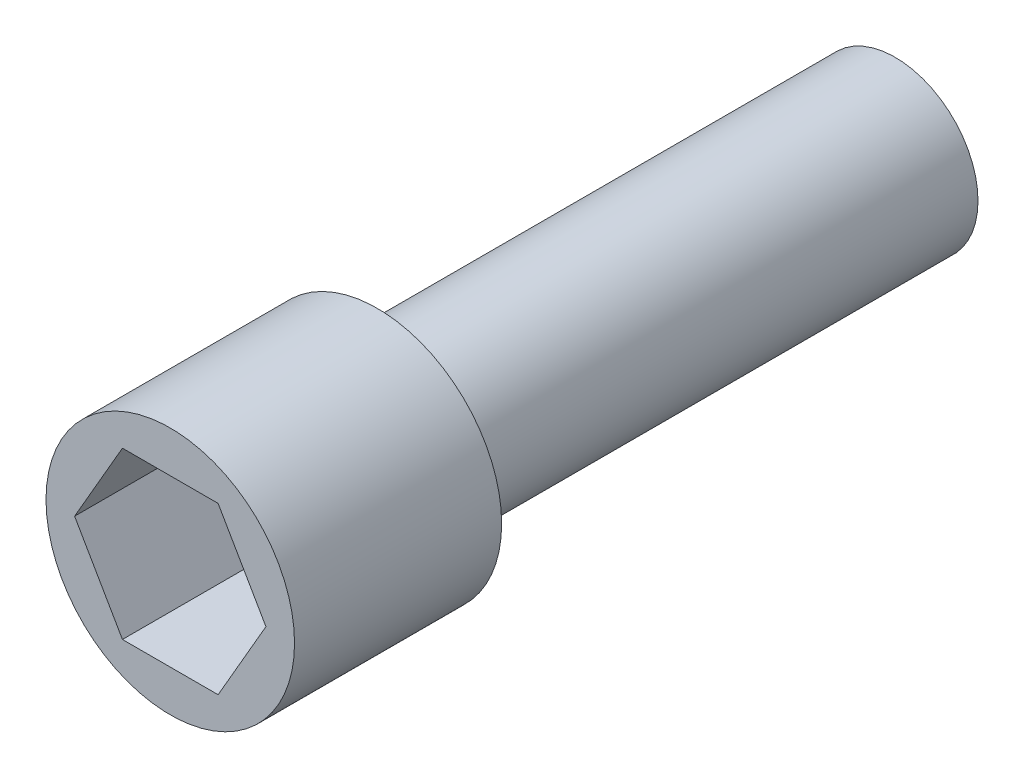
ISO-10303-21;
HEADER;
FILE_DESCRIPTION(('STEP AP214'),'2;1');
FILE_NAME('part.step','',(''),(''),'','','');
FILE_SCHEMA(('AUTOMOTIVE_DESIGN { 1 0 10303 214 1 1 1 1 }'));
ENDSEC;
DATA;
#1=APPLICATION_CONTEXT('core data for automotive mechanical design processes');
#2=APPLICATION_PROTOCOL_DEFINITION('international standard','automotive_design',2000,#1);
#3=PRODUCT_CONTEXT('',#1,'mechanical');
#4=PRODUCT('Part','Part','',(#3));
#5=PRODUCT_RELATED_PRODUCT_CATEGORY('part','',(#4));
#6=PRODUCT_DEFINITION_FORMATION('','',#4);
#7=PRODUCT_DEFINITION_CONTEXT('part definition',#1,'design');
#8=PRODUCT_DEFINITION('design','',#6,#7);
#9=PRODUCT_DEFINITION_SHAPE('','',#8);
#10=(LENGTH_UNIT() NAMED_UNIT(*) SI_UNIT(.MILLI.,.METRE.));
#11=(NAMED_UNIT(*) PLANE_ANGLE_UNIT() SI_UNIT($,.RADIAN.));
#12=(NAMED_UNIT(*) SI_UNIT($,.STERADIAN.) SOLID_ANGLE_UNIT());
#13=UNCERTAINTY_MEASURE_WITH_UNIT(LENGTH_MEASURE(1.E-05),#10,'distance_accuracy_value','');
#14=(GEOMETRIC_REPRESENTATION_CONTEXT(3) GLOBAL_UNCERTAINTY_ASSIGNED_CONTEXT((#13)) GLOBAL_UNIT_ASSIGNED_CONTEXT((#10,
#11,#12)) REPRESENTATION_CONTEXT('',''));
#15=CARTESIAN_POINT('',(0.,0.,0.));
#16=DIRECTION('',(0.,0.,1.));
#17=DIRECTION('',(1.,0.,0.));
#18=AXIS2_PLACEMENT_3D('',#15,#16,#17);
#19=CARTESIAN_POINT('',(0.,0.,-10.));
#20=DIRECTION('',(0.,0.,1.));
#21=DIRECTION('',(1.,0.,0.));
#22=AXIS2_PLACEMENT_3D('',#19,#20,#21);
#23=CYLINDRICAL_SURFACE('',#22,6.);
#24=CARTESIAN_POINT('',(0.,0.,-10.));
#25=DIRECTION('',(0.,0.,1.));
#26=DIRECTION('',(1.,0.,0.));
#27=AXIS2_PLACEMENT_3D('',#24,#25,#26);
#28=CIRCLE('',#27,6.);
#29=CARTESIAN_POINT('',(6.,0.,-10.));
#30=VERTEX_POINT('',#29);
#31=EDGE_CURVE('E11',#30,#30,#28,.T.);
#32=ORIENTED_EDGE('',*,*,#31,.T.);
#33=EDGE_LOOP('',(#32));
#34=FACE_BOUND('',#33,.T.);
#35=CARTESIAN_POINT('',(0.,0.,0.));
#36=DIRECTION('',(0.,0.,1.));
#37=DIRECTION('',(1.,0.,0.));
#38=AXIS2_PLACEMENT_3D('',#35,#36,#37);
#39=CIRCLE('',#38,6.);
#40=CARTESIAN_POINT('',(6.,0.,0.));
#41=VERTEX_POINT('',#40);
#42=EDGE_CURVE('E42',#41,#41,#39,.T.);
#43=ORIENTED_EDGE('',*,*,#42,.F.);
#44=EDGE_LOOP('',(#43));
#45=FACE_BOUND('',#44,.T.);
#46=ADVANCED_FACE('F39',(#34,#45),#23,.T.);
#47=CARTESIAN_POINT('',(0.,0.,-10.));
#48=DIRECTION('',(0.,0.,1.));
#49=DIRECTION('',(1.,0.,0.));
#50=AXIS2_PLACEMENT_3D('',#47,#48,#49);
#51=PLANE('',#50);
#52=CARTESIAN_POINT('',(0.,0.,-10.));
#53=DIRECTION('',(0.,0.,1.));
#54=DIRECTION('',(1.,0.,0.));
#55=AXIS2_PLACEMENT_3D('',#52,#53,#54);
#56=CIRCLE('',#55,4.);
#57=CARTESIAN_POINT('',(4.,0.,-10.));
#58=VERTEX_POINT('',#57);
#59=EDGE_CURVE('E148',#58,#58,#56,.T.);
#60=ORIENTED_EDGE('',*,*,#59,.T.);
#61=EDGE_LOOP('',(#60));
#62=FACE_BOUND('',#61,.T.);
#63=ORIENTED_EDGE('',*,*,#31,.F.);
#64=EDGE_LOOP('',(#63));
#65=FACE_BOUND('',#64,.T.);
#66=ADVANCED_FACE('F158',(#62,#65),#51,.F.);
#67=CARTESIAN_POINT('',(0.,0.,0.));
#68=DIRECTION('',(0.,0.,1.));
#69=DIRECTION('',(1.,0.,0.));
#70=AXIS2_PLACEMENT_3D('',#67,#68,#69);
#71=PLANE('',#70);
#72=DIRECTION('',(-0.5,0.866025403784438,0.));
#73=VECTOR('',#72,1.);
#74=CARTESIAN_POINT('',(4.61880215351701,0.,0.));
#75=LINE('',#74,#73);
#76=CARTESIAN_POINT('',(4.61880215351701,0.,0.));
#77=VERTEX_POINT('',#76);
#78=CARTESIAN_POINT('',(2.3094010767585,4.,0.));
#79=VERTEX_POINT('',#78);
#80=EDGE_CURVE('E53',#77,#79,#75,.T.);
#81=ORIENTED_EDGE('',*,*,#80,.F.);
#82=DIRECTION('',(0.5,0.866025403784439,0.));
#83=VECTOR('',#82,1.);
#84=CARTESIAN_POINT('',(2.3094010767585,-4.,0.));
#85=LINE('',#84,#83);
#86=CARTESIAN_POINT('',(2.3094010767585,-4.,0.));
#87=VERTEX_POINT('',#86);
#88=EDGE_CURVE('E136',#87,#77,#85,.T.);
#89=ORIENTED_EDGE('',*,*,#88,.F.);
#90=DIRECTION('',(1.,0.,0.));
#91=VECTOR('',#90,1.);
#92=CARTESIAN_POINT('',(-2.3094010767585,-4.,0.));
#93=LINE('',#92,#91);
#94=CARTESIAN_POINT('',(-2.3094010767585,-4.,0.));
#95=VERTEX_POINT('',#94);
#96=EDGE_CURVE('E134',#95,#87,#93,.T.);
#97=ORIENTED_EDGE('',*,*,#96,.F.);
#98=DIRECTION('',(0.5,-0.866025403784438,0.));
#99=VECTOR('',#98,1.);
#100=CARTESIAN_POINT('',(-4.61880215351701,0.,0.));
#101=LINE('',#100,#99);
#102=CARTESIAN_POINT('',(-4.61880215351701,0.,0.));
#103=VERTEX_POINT('',#102);
#104=EDGE_CURVE('E101',#103,#95,#101,.T.);
#105=ORIENTED_EDGE('',*,*,#104,.F.);
#106=DIRECTION('',(-0.5,-0.866025403784439,0.));
#107=VECTOR('',#106,1.);
#108=CARTESIAN_POINT('',(-2.3094010767585,4.,0.));
#109=LINE('',#108,#107);
#110=CARTESIAN_POINT('',(-2.3094010767585,4.,0.));
#111=VERTEX_POINT('',#110);
#112=EDGE_CURVE('E130',#111,#103,#109,.T.);
#113=ORIENTED_EDGE('',*,*,#112,.F.);
#114=DIRECTION('',(-1.,0.,0.));
#115=VECTOR('',#114,1.);
#116=CARTESIAN_POINT('',(2.3094010767585,4.,0.));
#117=LINE('',#116,#115);
#118=EDGE_CURVE('E127',#79,#111,#117,.T.);
#119=ORIENTED_EDGE('',*,*,#118,.F.);
#120=EDGE_LOOP('',(#81,#89,#97,#105,#113,#119));
#121=FACE_BOUND('',#120,.T.);
#122=ORIENTED_EDGE('',*,*,#42,.T.);
#123=EDGE_LOOP('',(#122));
#124=FACE_BOUND('',#123,.T.);
#125=ADVANCED_FACE('F155',(#121,#124),#71,.T.);
#126=CARTESIAN_POINT('',(0.,0.,-35.));
#127=DIRECTION('',(0.,0.,1.));
#128=DIRECTION('',(1.,0.,0.));
#129=AXIS2_PLACEMENT_3D('',#126,#127,#128);
#130=CYLINDRICAL_SURFACE('',#129,4.);
#131=CARTESIAN_POINT('',(0.,0.,-35.));
#132=DIRECTION('',(0.,0.,1.));
#133=DIRECTION('',(1.,0.,0.));
#134=AXIS2_PLACEMENT_3D('',#131,#132,#133);
#135=CIRCLE('',#134,4.);
#136=CARTESIAN_POINT('',(4.,0.,-35.));
#137=VERTEX_POINT('',#136);
#138=EDGE_CURVE('E140',#137,#137,#135,.T.);
#139=ORIENTED_EDGE('',*,*,#138,.T.);
#140=EDGE_LOOP('',(#139));
#141=FACE_BOUND('',#140,.T.);
#142=ORIENTED_EDGE('',*,*,#59,.F.);
#143=EDGE_LOOP('',(#142));
#144=FACE_BOUND('',#143,.T.);
#145=ADVANCED_FACE('F170',(#141,#144),#130,.T.);
#146=CARTESIAN_POINT('',(0.,0.,-35.));
#147=DIRECTION('',(0.,0.,1.));
#148=DIRECTION('',(1.,0.,0.));
#149=AXIS2_PLACEMENT_3D('',#146,#147,#148);
#150=PLANE('',#149);
#151=ORIENTED_EDGE('',*,*,#138,.F.);
#152=EDGE_LOOP('',(#151));
#153=FACE_BOUND('',#152,.T.);
#154=ADVANCED_FACE('F174',(#153),#150,.F.);
#155=CARTESIAN_POINT('',(4.61880215351701,0.,-7.));
#156=DIRECTION('',(0.866025403784438,0.5,0.));
#157=DIRECTION('',(-0.5,0.866025403784439,0.));
#158=AXIS2_PLACEMENT_3D('',#155,#156,#157);
#159=PLANE('',#158);
#160=ORIENTED_EDGE('',*,*,#80,.T.);
#161=DIRECTION('',(0.,0.,1.));
#162=VECTOR('',#161,1.);
#163=CARTESIAN_POINT('',(2.3094010767585,4.,-7.));
#164=LINE('',#163,#162);
#165=CARTESIAN_POINT('',(2.3094010767585,4.,-7.));
#166=VERTEX_POINT('',#165);
#167=EDGE_CURVE('E83',#166,#79,#164,.T.);
#168=ORIENTED_EDGE('',*,*,#167,.F.);
#169=DIRECTION('',(-0.5,0.866025403784438,0.));
#170=VECTOR('',#169,1.);
#171=CARTESIAN_POINT('',(4.61880215351701,0.,-7.));
#172=LINE('',#171,#170);
#173=CARTESIAN_POINT('',(4.61880215351701,0.,-7.));
#174=VERTEX_POINT('',#173);
#175=EDGE_CURVE('E138',#174,#166,#172,.T.);
#176=ORIENTED_EDGE('',*,*,#175,.F.);
#177=DIRECTION('',(0.,0.,1.));
#178=VECTOR('',#177,1.);
#179=CARTESIAN_POINT('',(4.61880215351701,0.,-7.));
#180=LINE('',#179,#178);
#181=EDGE_CURVE('E61',#174,#77,#180,.T.);
#182=ORIENTED_EDGE('',*,*,#181,.T.);
#183=EDGE_LOOP('',(#160,#168,#176,#182));
#184=FACE_BOUND('',#183,.T.);
#185=ADVANCED_FACE('F178',(#184),#159,.F.);
#186=CARTESIAN_POINT('',(2.3094010767585,-4.,-7.));
#187=DIRECTION('',(0.866025403784439,-0.5,0.));
#188=DIRECTION('',(0.5,0.866025403784439,0.));
#189=AXIS2_PLACEMENT_3D('',#186,#187,#188);
#190=PLANE('',#189);
#191=ORIENTED_EDGE('',*,*,#88,.T.);
#192=ORIENTED_EDGE('',*,*,#181,.F.);
#193=DIRECTION('',(0.5,0.866025403784439,0.));
#194=VECTOR('',#193,1.);
#195=CARTESIAN_POINT('',(2.3094010767585,-4.,-7.));
#196=LINE('',#195,#194);
#197=CARTESIAN_POINT('',(2.3094010767585,-4.,-7.));
#198=VERTEX_POINT('',#197);
#199=EDGE_CURVE('E113',#198,#174,#196,.T.);
#200=ORIENTED_EDGE('',*,*,#199,.F.);
#201=DIRECTION('',(0.,0.,1.));
#202=VECTOR('',#201,1.);
#203=CARTESIAN_POINT('',(2.3094010767585,-4.,-7.));
#204=LINE('',#203,#202);
#205=EDGE_CURVE('E105',#198,#87,#204,.T.);
#206=ORIENTED_EDGE('',*,*,#205,.T.);
#207=EDGE_LOOP('',(#191,#192,#200,#206));
#208=FACE_BOUND('',#207,.T.);
#209=ADVANCED_FACE('F182',(#208),#190,.F.);
#210=CARTESIAN_POINT('',(-2.3094010767585,-4.,-7.));
#211=DIRECTION('',(0.,-1.,0.));
#212=DIRECTION('',(0.,0.,-1.));
#213=AXIS2_PLACEMENT_3D('',#210,#211,#212);
#214=PLANE('',#213);
#215=ORIENTED_EDGE('',*,*,#96,.T.);
#216=ORIENTED_EDGE('',*,*,#205,.F.);
#217=DIRECTION('',(1.,0.,0.));
#218=VECTOR('',#217,1.);
#219=CARTESIAN_POINT('',(-2.3094010767585,-4.,-7.));
#220=LINE('',#219,#218);
#221=CARTESIAN_POINT('',(-2.3094010767585,-4.,-7.));
#222=VERTEX_POINT('',#221);
#223=EDGE_CURVE('E109',#222,#198,#220,.T.);
#224=ORIENTED_EDGE('',*,*,#223,.F.);
#225=DIRECTION('',(0.,0.,1.));
#226=VECTOR('',#225,1.);
#227=CARTESIAN_POINT('',(-2.3094010767585,-4.,-7.));
#228=LINE('',#227,#226);
#229=EDGE_CURVE('E94',#222,#95,#228,.T.);
#230=ORIENTED_EDGE('',*,*,#229,.T.);
#231=EDGE_LOOP('',(#215,#216,#224,#230));
#232=FACE_BOUND('',#231,.T.);
#233=ADVANCED_FACE('F110',(#232),#214,.F.);
#234=CARTESIAN_POINT('',(-4.61880215351701,0.,-7.));
#235=DIRECTION('',(-0.866025403784438,-0.5,0.));
#236=DIRECTION('',(0.5,-0.866025403784439,0.));
#237=AXIS2_PLACEMENT_3D('',#234,#235,#236);
#238=PLANE('',#237);
#239=ORIENTED_EDGE('',*,*,#104,.T.);
#240=ORIENTED_EDGE('',*,*,#229,.F.);
#241=DIRECTION('',(0.5,-0.866025403784438,0.));
#242=VECTOR('',#241,1.);
#243=CARTESIAN_POINT('',(-4.61880215351701,0.,-7.));
#244=LINE('',#243,#242);
#245=CARTESIAN_POINT('',(-4.61880215351701,0.,-7.));
#246=VERTEX_POINT('',#245);
#247=EDGE_CURVE('E98',#246,#222,#244,.T.);
#248=ORIENTED_EDGE('',*,*,#247,.F.);
#249=DIRECTION('',(0.,0.,1.));
#250=VECTOR('',#249,1.);
#251=CARTESIAN_POINT('',(-4.61880215351701,0.,-7.));
#252=LINE('',#251,#250);
#253=EDGE_CURVE('E106',#246,#103,#252,.T.);
#254=ORIENTED_EDGE('',*,*,#253,.T.);
#255=EDGE_LOOP('',(#239,#240,#248,#254));
#256=FACE_BOUND('',#255,.T.);
#257=ADVANCED_FACE('F96',(#256),#238,.F.);
#258=CARTESIAN_POINT('',(-2.3094010767585,4.,-7.));
#259=DIRECTION('',(-0.866025403784439,0.5,0.));
#260=DIRECTION('',(-0.5,-0.866025403784439,0.));
#261=AXIS2_PLACEMENT_3D('',#258,#259,#260);
#262=PLANE('',#261);
#263=ORIENTED_EDGE('',*,*,#112,.T.);
#264=ORIENTED_EDGE('',*,*,#253,.F.);
#265=DIRECTION('',(-0.5,-0.866025403784439,0.));
#266=VECTOR('',#265,1.);
#267=CARTESIAN_POINT('',(-2.3094010767585,4.,-7.));
#268=LINE('',#267,#266);
#269=CARTESIAN_POINT('',(-2.3094010767585,4.,-7.));
#270=VERTEX_POINT('',#269);
#271=EDGE_CURVE('E119',#270,#246,#268,.T.);
#272=ORIENTED_EDGE('',*,*,#271,.F.);
#273=DIRECTION('',(0.,0.,1.));
#274=VECTOR('',#273,1.);
#275=CARTESIAN_POINT('',(-2.3094010767585,4.,-7.));
#276=LINE('',#275,#274);
#277=EDGE_CURVE('E143',#270,#111,#276,.T.);
#278=ORIENTED_EDGE('',*,*,#277,.T.);
#279=EDGE_LOOP('',(#263,#264,#272,#278));
#280=FACE_BOUND('',#279,.T.);
#281=ADVANCED_FACE('F186',(#280),#262,.F.);
#282=CARTESIAN_POINT('',(2.3094010767585,4.,-7.));
#283=DIRECTION('',(0.,1.,0.));
#284=DIRECTION('',(0.,0.,1.));
#285=AXIS2_PLACEMENT_3D('',#282,#283,#284);
#286=PLANE('',#285);
#287=ORIENTED_EDGE('',*,*,#118,.T.);
#288=ORIENTED_EDGE('',*,*,#277,.F.);
#289=DIRECTION('',(-1.,0.,0.));
#290=VECTOR('',#289,1.);
#291=CARTESIAN_POINT('',(2.3094010767585,4.,-7.));
#292=LINE('',#291,#290);
#293=EDGE_CURVE('E121',#166,#270,#292,.T.);
#294=ORIENTED_EDGE('',*,*,#293,.F.);
#295=ORIENTED_EDGE('',*,*,#167,.T.);
#296=EDGE_LOOP('',(#287,#288,#294,#295));
#297=FACE_BOUND('',#296,.T.);
#298=ADVANCED_FACE('F183',(#297),#286,.F.);
#299=CARTESIAN_POINT('',(0.,0.,-7.));
#300=DIRECTION('',(0.,0.,1.));
#301=DIRECTION('',(1.,0.,0.));
#302=AXIS2_PLACEMENT_3D('',#299,#300,#301);
#303=PLANE('',#302);
#304=ORIENTED_EDGE('',*,*,#175,.T.);
#305=ORIENTED_EDGE('',*,*,#293,.T.);
#306=ORIENTED_EDGE('',*,*,#271,.T.);
#307=ORIENTED_EDGE('',*,*,#247,.T.);
#308=ORIENTED_EDGE('',*,*,#223,.T.);
#309=ORIENTED_EDGE('',*,*,#199,.T.);
#310=EDGE_LOOP('',(#304,#305,#306,#307,#308,#309));
#311=FACE_BOUND('',#310,.T.);
#312=ADVANCED_FACE('F116',(#311),#303,.T.);
#313=CLOSED_SHELL('',(#46,#66,#125,#145,#154,#185,#209,#233,#257,#281,#298,#312));
#314=MANIFOLD_SOLID_BREP('B2',#313);
#315=ADVANCED_BREP_SHAPE_REPRESENTATION('',(#18,#314),#14);
#316=SHAPE_DEFINITION_REPRESENTATION(#9,#315);
ENDSEC;
END-ISO-10303-21;
